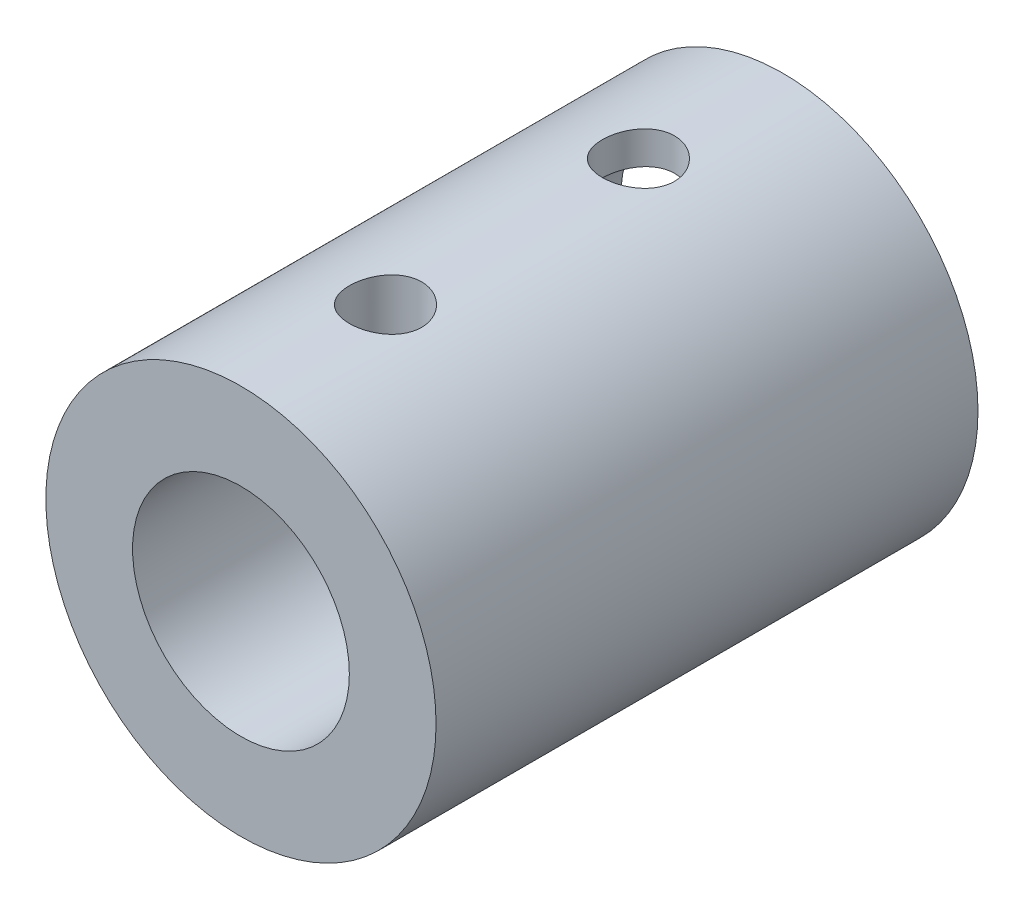
ISO-10303-21;
HEADER;
FILE_DESCRIPTION(('STEP AP214'),'2;1');
FILE_NAME('part.step','',(''),(''),'','','');
FILE_SCHEMA(('AUTOMOTIVE_DESIGN { 1 0 10303 214 1 1 1 1 }'));
ENDSEC;
DATA;
#1=APPLICATION_CONTEXT('core data for automotive mechanical design processes');
#2=APPLICATION_PROTOCOL_DEFINITION('international standard','automotive_design',2000,#1);
#3=PRODUCT_CONTEXT('',#1,'mechanical');
#4=PRODUCT('Part','Part','',(#3));
#5=PRODUCT_RELATED_PRODUCT_CATEGORY('part','',(#4));
#6=PRODUCT_DEFINITION_FORMATION('','',#4);
#7=PRODUCT_DEFINITION_CONTEXT('part definition',#1,'design');
#8=PRODUCT_DEFINITION('design','',#6,#7);
#9=PRODUCT_DEFINITION_SHAPE('','',#8);
#10=(LENGTH_UNIT() NAMED_UNIT(*) SI_UNIT(.MILLI.,.METRE.));
#11=(NAMED_UNIT(*) PLANE_ANGLE_UNIT() SI_UNIT($,.RADIAN.));
#12=(NAMED_UNIT(*) SI_UNIT($,.STERADIAN.) SOLID_ANGLE_UNIT());
#13=UNCERTAINTY_MEASURE_WITH_UNIT(LENGTH_MEASURE(1.E-05),#10,'distance_accuracy_value','');
#14=(GEOMETRIC_REPRESENTATION_CONTEXT(3) GLOBAL_UNCERTAINTY_ASSIGNED_CONTEXT((#13)) GLOBAL_UNIT_ASSIGNED_CONTEXT((#10,
#11,#12)) REPRESENTATION_CONTEXT('',''));
#15=CARTESIAN_POINT('',(0.,0.,0.));
#16=DIRECTION('',(0.,0.,1.));
#17=DIRECTION('',(1.,0.,0.));
#18=AXIS2_PLACEMENT_3D('',#15,#16,#17);
#19=CARTESIAN_POINT('',(0.,0.,0.));
#20=DIRECTION('',(0.,0.,1.));
#21=DIRECTION('',(1.,0.,0.));
#22=AXIS2_PLACEMENT_3D('',#19,#20,#21);
#23=CYLINDRICAL_SURFACE('',#22,5.4);
#24=CARTESIAN_POINT('',(0.,5.4,-4.5));
#25=CARTESIAN_POINT('',(0.0556604896939822,5.39999899659442,-4.49999785988244));
#26=CARTESIAN_POINT('',(0.111348969502443,5.39913052478065,-4.49533716167985));
#27=CARTESIAN_POINT('',(0.221157519706214,5.39574971760259,-4.47682901836152));
#28=CARTESIAN_POINT('',(0.275276211455409,5.3932359803846,-4.46297373883295));
#29=CARTESIAN_POINT('',(0.380341159747422,5.38684592389532,-4.42651451628888));
#30=CARTESIAN_POINT('',(0.431290203036905,5.38297082204496,-4.40391838809039));
#31=CARTESIAN_POINT('',(0.528669059396653,5.37428153225005,-4.35064087689537));
#32=CARTESIAN_POINT('',(0.575099255261279,5.36946742395328,-4.31996017956541));
#33=CARTESIAN_POINT('',(0.662670331022381,5.35936880012669,-4.25100346875391));
#34=CARTESIAN_POINT('',(0.703750717092386,5.35407988568635,-4.21265126783419));
#35=CARTESIAN_POINT('',(0.778932810187149,5.34366050938683,-4.12960413184714));
#36=CARTESIAN_POINT('',(0.813034023333889,5.33853005876308,-4.08490874828609));
#37=CARTESIAN_POINT('',(0.873540311641142,5.32896576362374,-3.99001784987536));
#38=CARTESIAN_POINT('',(0.899884048440948,5.32453759246524,-3.93978260109209));
#39=CARTESIAN_POINT('',(0.94373496793374,5.31694110772514,-3.83550374767132));
#40=CARTESIAN_POINT('',(0.9612428931323,5.31377268828674,-3.78146046347206));
#41=CARTESIAN_POINT('',(0.986731465585703,5.30909866934742,-3.67174623105857));
#42=CARTESIAN_POINT('',(0.994817491817906,5.30757469216746,-3.61610056260907));
#43=CARTESIAN_POINT('',(1.0015597824359,5.30630668029092,-3.50422307986216));
#44=CARTESIAN_POINT('',(1.00021687146053,5.30656248993717,-3.44799131725305));
#45=CARTESIAN_POINT('',(0.988224901570252,5.30880841085454,-3.3373000011608));
#46=CARTESIAN_POINT('',(0.97769550042022,5.31077622168995,-3.28282696511513));
#47=CARTESIAN_POINT('',(0.947817807343393,5.31618940857766,-3.17643418695685));
#48=CARTESIAN_POINT('',(0.928469149021419,5.31963484601746,-3.1245145510243));
#49=CARTESIAN_POINT('',(0.881384660081291,5.32763847511037,-3.02435132487239));
#50=CARTESIAN_POINT('',(0.853600353848329,5.33220306803316,-2.97613105456559));
#51=CARTESIAN_POINT('',(0.790467562244113,5.34192643691731,-2.88499200414442));
#52=CARTESIAN_POINT('',(0.755118327426643,5.34708527172593,-2.84207374995783));
#53=CARTESIAN_POINT('',(0.677213176267708,5.35751311929745,-2.76206552016118));
#54=CARTESIAN_POINT('',(0.634554875003939,5.36278260703325,-2.72507522788993));
#55=CARTESIAN_POINT('',(0.543585529598496,5.37276512878244,-2.65876104678889));
#56=CARTESIAN_POINT('',(0.495274431394655,5.37747815747312,-2.62943723128834));
#57=CARTESIAN_POINT('',(0.394268082578696,5.38582589434646,-2.57927437224751));
#58=CARTESIAN_POINT('',(0.341567659863976,5.38945930668765,-2.55844551395307));
#59=CARTESIAN_POINT('',(0.233333816527491,5.39522837045863,-2.5259636391794));
#60=CARTESIAN_POINT('',(0.177800689988553,5.39736417702724,-2.51430967224649));
#61=CARTESIAN_POINT('',(0.0663356134919621,5.39987612432976,-2.50064672026573));
#62=CARTESIAN_POINT('',(0.0104209521169561,5.40027718700497,-2.49850112351799));
#63=CARTESIAN_POINT('',(-0.100968245481161,5.39934323168058,-2.50354963095807));
#64=CARTESIAN_POINT('',(-0.156442802648481,5.3980082968004,-2.51074328798311));
#65=CARTESIAN_POINT('',(-0.264945081991777,5.39376784929595,-2.53415251483885));
#66=CARTESIAN_POINT('',(-0.317988190561706,5.39087434486991,-2.55029913303865));
#67=CARTESIAN_POINT('',(-0.420614458748235,5.38383985678366,-2.59108145285172));
#68=CARTESIAN_POINT('',(-0.470197387707151,5.37969879005782,-2.61571771974139));
#69=CARTESIAN_POINT('',(-0.565080058501055,5.37056636600975,-2.6730835898021));
#70=CARTESIAN_POINT('',(-0.610328354131309,5.36556639333382,-2.70589688519212));
#71=CARTESIAN_POINT('',(-0.694725332662061,5.35529340783008,-2.77857189616404));
#72=CARTESIAN_POINT('',(-0.73387346032526,5.35002037020603,-2.81843425264735));
#73=CARTESIAN_POINT('',(-0.805476459391045,5.33971312164955,-2.90469365827947));
#74=CARTESIAN_POINT('',(-0.837838206141855,5.33468288206522,-2.95116856224134));
#75=CARTESIAN_POINT('',(-0.894295582963874,5.32551001203301,-3.04897517975559));
#76=CARTESIAN_POINT('',(-0.918391515518115,5.32136734910682,-3.10030671549442));
#77=CARTESIAN_POINT('',(-0.957500388169906,5.31446969122803,-3.20613027902271));
#78=CARTESIAN_POINT('',(-0.972556436956279,5.31170812094277,-3.26060592673707));
#79=CARTESIAN_POINT('',(-0.993291444677279,5.30787012468241,-3.37136947293782));
#80=CARTESIAN_POINT('',(-0.998971432667995,5.30679351377768,-3.42765717185372));
#81=CARTESIAN_POINT('',(-1.00075931276034,5.30645655210111,-3.53951457036673));
#82=CARTESIAN_POINT('',(-0.997014059695887,5.30716833604253,-3.59508189199872));
#83=CARTESIAN_POINT('',(-0.98037882439304,5.31026625942455,-3.70478037964699));
#84=CARTESIAN_POINT('',(-0.967488893630063,5.31265238944026,-3.75891155374557));
#85=CARTESIAN_POINT('',(-0.932991513043014,5.31881854519827,-3.86412474685557));
#86=CARTESIAN_POINT('',(-0.911399587855034,5.32259608758904,-3.91521201097));
#87=CARTESIAN_POINT('',(-0.860127070854903,5.33112125899417,-4.01306235448465));
#88=CARTESIAN_POINT('',(-0.830445927033412,5.33586895420635,-4.05982513849));
#89=CARTESIAN_POINT('',(-0.763325369214999,5.34588620139029,-4.14843547260882));
#90=CARTESIAN_POINT('',(-0.725778938254149,5.35116236451393,-4.19020122576754));
#91=CARTESIAN_POINT('',(-0.64421709909816,5.3615922231753,-4.26688863340875));
#92=CARTESIAN_POINT('',(-0.600200206474231,5.36674589029445,-4.3018087130814));
#93=CARTESIAN_POINT('',(-0.506485845843657,5.37640290849601,-4.36409831671839));
#94=CARTESIAN_POINT('',(-0.456742043621885,5.38090017485251,-4.39139910104173));
#95=CARTESIAN_POINT('',(-0.353306995492875,5.38867830228998,-4.43721254804973));
#96=CARTESIAN_POINT('',(-0.299619539473832,5.39196031337996,-4.45573352383719));
#97=CARTESIAN_POINT('',(-0.204806715075687,5.39626347553588,-4.47967054296795));
#98=CARTESIAN_POINT('',(-0.164238042203387,5.39765680904242,-4.48728115769209));
#99=CARTESIAN_POINT('',(-0.0824513558551124,5.39952543175235,-4.49744661731647));
#100=CARTESIAN_POINT('',(-0.0412333582251356,5.40000074332407,-4.50000158540168));
#101=CARTESIAN_POINT('',(0.,5.4,-4.5));
#102=B_SPLINE_CURVE_WITH_KNOTS('',3,(#24,#25,#26,#27,#28,#29,#30,#31,#32,#33,#34,#35,#36,#37,
#38,#39,#40,#41,#42,#43,#44,#45,#46,#47,#48,#49,#50,#51,#52,#53,#54,#55,#56,#57,#58,#59,#60,#61,
#62,#63,#64,#65,#66,#67,#68,#69,#70,#71,#72,#73,#74,#75,#76,#77,#78,#79,#80,#81,#82,#83,#84,#85,
#86,#87,#88,#89,#90,#91,#92,#93,#94,#95,#96,#97,#98,#99,#100,#101),.UNSPECIFIED.,.T.,.F.,(4,2,2,
2,2,2,2,2,2,2,2,2,2,2,2,2,2,2,2,2,2,2,2,2,2,2,2,2,2,2,2,2,2,2,2,2,2,2,4),(0.,0.166830684743597,
0.333803703486145,0.500627782580659,0.667437717581664,0.835994817748764,1.00456384166177,
1.17443200011244,1.34428588154242,1.51222122651588,1.68014188433212,1.84590742201222,
2.01167984703317,2.1784235199099,2.34518371948756,2.51450617923376,2.68383025847696,
2.85335676051565,3.02286569849921,3.18993114894036,3.35698860059497,3.5227769720103,
3.68857638444373,3.85614796888962,4.02373479680335,4.19348930256164,4.36323759558209,
4.53216984076862,4.70108354380611,4.86738174567473,5.0336790114577,5.19968090169824,
5.36569412276716,5.53413289671374,5.70261037372837,5.87256200203699,6.04235238977767,
6.16594377467511,6.28953214812993),.UNSPECIFIED.);
#103=CARTESIAN_POINT('',(0.,5.4,-4.5));
#104=VERTEX_POINT('',#103);
#105=EDGE_CURVE('E53',#104,#104,#102,.T.);
#106=ORIENTED_EDGE('',*,*,#105,.T.);
#107=EDGE_LOOP('',(#106));
#108=FACE_BOUND('',#107,.T.);
#109=CARTESIAN_POINT('',(0.,0.,-7.5));
#110=DIRECTION('',(0.,0.,1.));
#111=DIRECTION('',(1.,0.,0.));
#112=AXIS2_PLACEMENT_3D('',#109,#110,#111);
#113=CIRCLE('',#112,5.4);
#114=CARTESIAN_POINT('',(5.4,0.,-7.5));
#115=VERTEX_POINT('',#114);
#116=EDGE_CURVE('E10',#115,#115,#113,.T.);
#117=ORIENTED_EDGE('',*,*,#116,.T.);
#118=EDGE_LOOP('',(#117));
#119=FACE_BOUND('',#118,.T.);
#120=CARTESIAN_POINT('',(0.,0.,7.5));
#121=DIRECTION('',(0.,0.,1.));
#122=DIRECTION('',(1.,0.,0.));
#123=AXIS2_PLACEMENT_3D('',#120,#121,#122);
#124=CIRCLE('',#123,5.4);
#125=CARTESIAN_POINT('',(5.4,0.,7.5));
#126=VERTEX_POINT('',#125);
#127=EDGE_CURVE('E44',#126,#126,#124,.T.);
#128=ORIENTED_EDGE('',*,*,#127,.F.);
#129=EDGE_LOOP('',(#128));
#130=FACE_BOUND('',#129,.T.);
#131=CARTESIAN_POINT('',(0.,5.4,2.5));
#132=CARTESIAN_POINT('',(0.0556604896939822,5.39999899659442,2.50000214011756));
#133=CARTESIAN_POINT('',(0.111348969502443,5.39913052478065,2.50466283832015));
#134=CARTESIAN_POINT('',(0.221157519706214,5.39574971760259,2.52317098163848));
#135=CARTESIAN_POINT('',(0.275276211455409,5.3932359803846,2.53702626116705));
#136=CARTESIAN_POINT('',(0.380341159747422,5.38684592389532,2.57348548371112));
#137=CARTESIAN_POINT('',(0.431290203036904,5.38297082204496,2.59608161190961));
#138=CARTESIAN_POINT('',(0.528669059396653,5.37428153225005,2.64935912310463));
#139=CARTESIAN_POINT('',(0.575099255261279,5.36946742395328,2.68003982043459));
#140=CARTESIAN_POINT('',(0.662670331022381,5.35936880012669,2.74899653124609));
#141=CARTESIAN_POINT('',(0.703750717092386,5.35407988568635,2.78734873216581));
#142=CARTESIAN_POINT('',(0.778932810187149,5.34366050938683,2.87039586815286));
#143=CARTESIAN_POINT('',(0.813034023333889,5.33853005876308,2.91509125171391));
#144=CARTESIAN_POINT('',(0.873540311641141,5.32896576362374,3.00998215012464));
#145=CARTESIAN_POINT('',(0.899884048440948,5.32453759246524,3.06021739890791));
#146=CARTESIAN_POINT('',(0.94373496793374,5.31694110772514,3.16449625232868));
#147=CARTESIAN_POINT('',(0.9612428931323,5.31377268828674,3.21853953652794));
#148=CARTESIAN_POINT('',(0.986731465585703,5.30909866934742,3.32825376894143));
#149=CARTESIAN_POINT('',(0.994817491817906,5.30757469216746,3.38389943739093));
#150=CARTESIAN_POINT('',(1.0015597824359,5.30630668029092,3.49577692013784));
#151=CARTESIAN_POINT('',(1.00021687146053,5.30656248993717,3.55200868274695));
#152=CARTESIAN_POINT('',(0.988224901570252,5.30880841085454,3.6626999988392));
#153=CARTESIAN_POINT('',(0.97769550042022,5.31077622168995,3.71717303488487));
#154=CARTESIAN_POINT('',(0.947817807343393,5.31618940857766,3.82356581304315));
#155=CARTESIAN_POINT('',(0.928469149021419,5.31963484601746,3.8754854489757));
#156=CARTESIAN_POINT('',(0.881384660081291,5.32763847511037,3.97564867512761));
#157=CARTESIAN_POINT('',(0.853600353848329,5.33220306803316,4.02386894543441));
#158=CARTESIAN_POINT('',(0.790467562244113,5.34192643691731,4.11500799585558));
#159=CARTESIAN_POINT('',(0.755118327426643,5.34708527172593,4.15792625004217));
#160=CARTESIAN_POINT('',(0.677213176267708,5.35751311929745,4.23793447983882));
#161=CARTESIAN_POINT('',(0.634554875003939,5.36278260703325,4.27492477211007));
#162=CARTESIAN_POINT('',(0.543585529598498,5.37276512878244,4.34123895321111));
#163=CARTESIAN_POINT('',(0.495274431394656,5.37747815747312,4.37056276871166));
#164=CARTESIAN_POINT('',(0.394268082578697,5.38582589434646,4.42072562775249));
#165=CARTESIAN_POINT('',(0.341567659863977,5.38945930668765,4.44155448604693));
#166=CARTESIAN_POINT('',(0.233333816527491,5.39522837045863,4.4740363608206));
#167=CARTESIAN_POINT('',(0.177800689988554,5.39736417702724,4.48569032775351));
#168=CARTESIAN_POINT('',(0.0663356134919625,5.39987612432976,4.49935327973427));
#169=CARTESIAN_POINT('',(0.0104209521169566,5.40027718700497,4.50149887648201));
#170=CARTESIAN_POINT('',(-0.100968245481161,5.39934323168058,4.49645036904193));
#171=CARTESIAN_POINT('',(-0.15644280264848,5.3980082968004,4.48925671201689));
#172=CARTESIAN_POINT('',(-0.264945081991776,5.39376784929595,4.46584748516115));
#173=CARTESIAN_POINT('',(-0.317988190561706,5.39087434486991,4.44970086696135));
#174=CARTESIAN_POINT('',(-0.420614458748234,5.38383985678366,4.40891854714828));
#175=CARTESIAN_POINT('',(-0.47019738770715,5.37969879005782,4.38428228025861));
#176=CARTESIAN_POINT('',(-0.565080058501055,5.37056636600975,4.3269164101979));
#177=CARTESIAN_POINT('',(-0.610328354131309,5.36556639333382,4.29410311480788));
#178=CARTESIAN_POINT('',(-0.694725332662061,5.35529340783008,4.22142810383596));
#179=CARTESIAN_POINT('',(-0.73387346032526,5.35002037020603,4.18156574735265));
#180=CARTESIAN_POINT('',(-0.805476459391044,5.33971312164955,4.09530634172053));
#181=CARTESIAN_POINT('',(-0.837838206141855,5.33468288206522,4.04883143775866));
#182=CARTESIAN_POINT('',(-0.894295582963875,5.32551001203301,3.95102482024441));
#183=CARTESIAN_POINT('',(-0.918391515518115,5.32136734910682,3.89969328450558));
#184=CARTESIAN_POINT('',(-0.957500388169906,5.31446969122803,3.79386972097729));
#185=CARTESIAN_POINT('',(-0.972556436956279,5.31170812094277,3.73939407326293));
#186=CARTESIAN_POINT('',(-0.993291444677279,5.30787012468241,3.62863052706218));
#187=CARTESIAN_POINT('',(-0.998971432667995,5.30679351377768,3.57234282814628));
#188=CARTESIAN_POINT('',(-1.00075931276034,5.30645655210111,3.46048542963327));
#189=CARTESIAN_POINT('',(-0.997014059695887,5.30716833604253,3.40491810800128));
#190=CARTESIAN_POINT('',(-0.98037882439304,5.31026625942455,3.29521962035301));
#191=CARTESIAN_POINT('',(-0.967488893630063,5.31265238944026,3.24108844625443));
#192=CARTESIAN_POINT('',(-0.932991513043014,5.31881854519827,3.13587525314444));
#193=CARTESIAN_POINT('',(-0.911399587855034,5.32259608758904,3.08478798903));
#194=CARTESIAN_POINT('',(-0.860127070854903,5.33112125899417,2.98693764551535));
#195=CARTESIAN_POINT('',(-0.830445927033412,5.33586895420635,2.94017486151));
#196=CARTESIAN_POINT('',(-0.763325369214999,5.34588620139029,2.85156452739118));
#197=CARTESIAN_POINT('',(-0.72577893825415,5.35116236451393,2.80979877423246));
#198=CARTESIAN_POINT('',(-0.64421709909816,5.3615922231753,2.73311136659125));
#199=CARTESIAN_POINT('',(-0.600200206474232,5.36674589029445,2.6981912869186));
#200=CARTESIAN_POINT('',(-0.506485845843658,5.37640290849601,2.63590168328161));
#201=CARTESIAN_POINT('',(-0.456742043621886,5.38090017485251,2.60860089895827));
#202=CARTESIAN_POINT('',(-0.353306995492876,5.38867830228998,2.56278745195027));
#203=CARTESIAN_POINT('',(-0.299619539473833,5.39196031337996,2.54426647616281));
#204=CARTESIAN_POINT('',(-0.204806715075687,5.39626347553588,2.52032945703205));
#205=CARTESIAN_POINT('',(-0.164238042203387,5.39765680904242,2.51271884230791));
#206=CARTESIAN_POINT('',(-0.082451355855112,5.39952543175235,2.50255338268353));
#207=CARTESIAN_POINT('',(-0.0412333582251354,5.40000074332407,2.49999841459832));
#208=CARTESIAN_POINT('',(0.,5.4,2.5));
#209=B_SPLINE_CURVE_WITH_KNOTS('',3,(#131,#132,#133,#134,#135,#136,#137,#138,#139,#140,#141,
#142,#143,#144,#145,#146,#147,#148,#149,#150,#151,#152,#153,#154,#155,#156,#157,#158,#159,#160,
#161,#162,#163,#164,#165,#166,#167,#168,#169,#170,#171,#172,#173,#174,#175,#176,#177,#178,#179,
#180,#181,#182,#183,#184,#185,#186,#187,#188,#189,#190,#191,#192,#193,#194,#195,#196,#197,#198,
#199,#200,#201,#202,#203,#204,#205,#206,#207,#208),.UNSPECIFIED.,.T.,.F.,(4,2,2,2,2,2,2,2,2,2,2,
2,2,2,2,2,2,2,2,2,2,2,2,2,2,2,2,2,2,2,2,2,2,2,2,2,2,2,4),(0.,0.166830684743597,
0.333803703486145,0.500627782580658,0.667437717581664,0.835994817748764,1.00456384166177,
1.17443200011244,1.34428588154242,1.51222122651588,1.68014188433212,1.84590742201222,
2.01167984703316,2.1784235199099,2.34518371948756,2.51450617923376,2.68383025847696,
2.85335676051565,3.02286569849921,3.18993114894036,3.35698860059497,3.5227769720103,
3.68857638444373,3.85614796888962,4.02373479680335,4.19348930256164,4.3632375955821,
4.53216984076862,4.70108354380611,4.86738174567473,5.0336790114577,5.19968090169824,
5.36569412276716,5.53413289671374,5.70261037372837,5.87256200203699,6.04235238977767,
6.16594377467512,6.28953214812993),.UNSPECIFIED.);
#210=CARTESIAN_POINT('',(0.,5.4,2.5));
#211=VERTEX_POINT('',#210);
#212=EDGE_CURVE('E49',#211,#211,#209,.T.);
#213=ORIENTED_EDGE('',*,*,#212,.T.);
#214=EDGE_LOOP('',(#213));
#215=FACE_BOUND('',#214,.T.);
#216=ADVANCED_FACE('F31',(#108,#119,#130,#215),#23,.T.);
#217=CARTESIAN_POINT('',(0.,0.,7.5));
#218=DIRECTION('',(0.,0.,1.));
#219=DIRECTION('',(1.,0.,0.));
#220=AXIS2_PLACEMENT_3D('',#217,#218,#219);
#221=PLANE('',#220);
#222=CARTESIAN_POINT('',(0.,0.,7.5));
#223=DIRECTION('',(0.,0.,1.));
#224=DIRECTION('',(1.,0.,0.));
#225=AXIS2_PLACEMENT_3D('',#222,#223,#224);
#226=CIRCLE('',#225,3.);
#227=CARTESIAN_POINT('',(3.,0.,7.5));
#228=VERTEX_POINT('',#227);
#229=EDGE_CURVE('E84',#228,#228,#226,.T.);
#230=ORIENTED_EDGE('',*,*,#229,.F.);
#231=EDGE_LOOP('',(#230));
#232=FACE_BOUND('',#231,.T.);
#233=ORIENTED_EDGE('',*,*,#127,.T.);
#234=EDGE_LOOP('',(#233));
#235=FACE_BOUND('',#234,.T.);
#236=ADVANCED_FACE('F33',(#232,#235),#221,.T.);
#237=CARTESIAN_POINT('',(0.,0.,-7.5));
#238=DIRECTION('',(0.,0.,-1.));
#239=DIRECTION('',(-1.,0.,0.));
#240=AXIS2_PLACEMENT_3D('',#237,#238,#239);
#241=PLANE('',#240);
#242=CARTESIAN_POINT('',(0.,0.,-7.5));
#243=DIRECTION('',(0.,0.,-1.));
#244=DIRECTION('',(-1.,0.,0.));
#245=AXIS2_PLACEMENT_3D('',#242,#243,#244);
#246=CIRCLE('',#245,4.5);
#247=CARTESIAN_POINT('',(-4.5,0.,-7.5));
#248=VERTEX_POINT('',#247);
#249=EDGE_CURVE('E94',#248,#248,#246,.T.);
#250=ORIENTED_EDGE('',*,*,#249,.F.);
#251=EDGE_LOOP('',(#250));
#252=FACE_BOUND('',#251,.T.);
#253=ORIENTED_EDGE('',*,*,#116,.F.);
#254=EDGE_LOOP('',(#253));
#255=FACE_BOUND('',#254,.T.);
#256=ADVANCED_FACE('F70',(#252,#255),#241,.T.);
#257=CARTESIAN_POINT('',(0.,10.,-3.5));
#258=DIRECTION('',(0.,-1.,0.));
#259=DIRECTION('',(0.,0.,-1.));
#260=AXIS2_PLACEMENT_3D('',#257,#258,#259);
#261=CYLINDRICAL_SURFACE('',#260,1.);
#262=CARTESIAN_POINT('',(0.,4.5,-4.5));
#263=CARTESIAN_POINT('',(-0.0554402383878237,4.49999898109126,-4.49999813816009));
#264=CARTESIAN_POINT('',(-0.11090278263481,4.49896506997846,-4.49537400916826));
#265=CARTESIAN_POINT('',(-0.220250972051566,4.49494048878835,-4.47701976382472));
#266=CARTESIAN_POINT('',(-0.274135487569493,4.49194845108674,-4.46328328299536));
#267=CARTESIAN_POINT('',(-0.378731638880764,4.48434056584504,-4.42715701475417));
#268=CARTESIAN_POINT('',(-0.429446576050142,4.47972644219541,-4.40477641150107));
#269=CARTESIAN_POINT('',(-0.52640009015688,4.46937167720689,-4.3520266937638));
#270=CARTESIAN_POINT('',(-0.572638753966673,4.46363105773679,-4.32165773435469));
#271=CARTESIAN_POINT('',(-0.660093157007017,4.45154547087105,-4.25326216744666));
#272=CARTESIAN_POINT('',(-0.701224306021767,4.44519280820714,-4.21512874893243));
#273=CARTESIAN_POINT('',(-0.776562455229185,4.43265300539893,-4.13251596995343));
#274=CARTESIAN_POINT('',(-0.810768822054276,4.42646588044024,-4.08803602964477));
#275=CARTESIAN_POINT('',(-0.871662217051752,4.41488164130856,-3.99336407797085));
#276=CARTESIAN_POINT('',(-0.898258710522017,4.40949437871491,-3.94311252097924));
#277=CARTESIAN_POINT('',(-0.94259649477254,4.40023048176198,-3.83871361915379));
#278=CARTESIAN_POINT('',(-0.96033888110048,4.39635366052386,-3.78456675724787));
#279=CARTESIAN_POINT('',(-0.986184290032021,4.39062804729594,-3.67483326133867));
#280=CARTESIAN_POINT('',(-0.994437335190343,4.38874772903892,-3.61928364244729));
#281=CARTESIAN_POINT('',(-1.00153635498836,4.38713336865335,-3.5075588911069));
#282=CARTESIAN_POINT('',(-1.00038352455831,4.38739905389469,-3.45138383901893));
#283=CARTESIAN_POINT('',(-0.988824137586508,4.39001816074073,-3.3411216864031));
#284=CARTESIAN_POINT('',(-0.978592322301084,4.3923321569242,-3.28701518793033));
#285=CARTESIAN_POINT('',(-0.949442453405729,4.39872477095838,-3.1813064283375));
#286=CARTESIAN_POINT('',(-0.930523898408257,4.40280349066588,-3.1297043119573));
#287=CARTESIAN_POINT('',(-0.884378364364372,4.41230454985148,-3.02998028080906));
#288=CARTESIAN_POINT('',(-0.857084596896763,4.41773762181245,-2.98189033633196));
#289=CARTESIAN_POINT('',(-0.795010340699247,4.42932868955372,-2.89090856474205));
#290=CARTESIAN_POINT('',(-0.76022880037137,4.43548678710298,-2.84801746908993));
#291=CARTESIAN_POINT('',(-0.683243418514913,4.44800287306333,-2.76764534532576));
#292=CARTESIAN_POINT('',(-0.640891102633116,4.45436225343936,-2.73030660744747));
#293=CARTESIAN_POINT('',(-0.550453309045809,4.46643919561158,-2.66323813554644));
#294=CARTESIAN_POINT('',(-0.502367720918685,4.47215674504213,-2.63350854810905));
#295=CARTESIAN_POINT('',(-0.401651595367367,4.48232532116804,-2.5824653621116));
#296=CARTESIAN_POINT('',(-0.349011061159926,4.4867734650383,-2.56117087784587));
#297=CARTESIAN_POINT('',(-0.240777965490727,4.49388068183127,-2.52776949347106));
#298=CARTESIAN_POINT('',(-0.185185848796682,4.49654002348392,-2.51566121329294));
#299=CARTESIAN_POINT('',(-0.0738477416404216,4.49973158880836,-2.50118399337241));
#300=CARTESIAN_POINT('',(-0.0181281986594518,4.50030624311145,-2.49862074991916));
#301=CARTESIAN_POINT('',(0.0929429619640405,4.49938279325299,-2.50277905213018));
#302=CARTESIAN_POINT('',(0.148294605135324,4.4978848344523,-2.50949994665972));
#303=CARTESIAN_POINT('',(0.256411628664712,4.49301129379307,-2.53187470758405));
#304=CARTESIAN_POINT('',(0.309199245857743,4.4896572350388,-2.54742622811172));
#305=CARTESIAN_POINT('',(0.411416402927916,4.48144710543397,-2.58690684372254));
#306=CARTESIAN_POINT('',(0.46084565000509,4.4765909038233,-2.610836668153));
#307=CARTESIAN_POINT('',(0.55574321994719,4.4658107661382,-2.66679643839949));
#308=CARTESIAN_POINT('',(0.601142865416124,4.45987222295123,-2.69893997150308));
#309=CARTESIAN_POINT('',(0.68597348249406,4.4476151617454,-2.77026562455072));
#310=CARTESIAN_POINT('',(0.725403650867064,4.44129659275087,-2.80944869016605));
#311=CARTESIAN_POINT('',(0.797947740954928,4.42884439472905,-2.89463401679035));
#312=CARTESIAN_POINT('',(0.830926909700367,4.42271658832142,-2.9407520450033));
#313=CARTESIAN_POINT('',(0.888673059613761,4.41147697689154,-3.03798601720541));
#314=CARTESIAN_POINT('',(0.913440399634869,4.40636512747635,-3.08910174267105));
#315=CARTESIAN_POINT('',(0.953890009481296,4.39778600274463,-3.19460414455257));
#316=CARTESIAN_POINT('',(0.969623931773796,4.39430939829893,-3.24897022113442));
#317=CARTESIAN_POINT('',(0.99171013829203,4.38937824848696,-3.35966209243124));
#318=CARTESIAN_POINT('',(0.998063978591782,4.38792336773666,-3.41598756051298));
#319=CARTESIAN_POINT('',(1.00114178320522,4.38722200724489,-3.52763943913916));
#320=CARTESIAN_POINT('',(0.998079565719667,4.38792649185062,-3.58295975403003));
#321=CARTESIAN_POINT('',(0.982891385608439,4.39135332478774,-3.69227485498341));
#322=CARTESIAN_POINT('',(0.970765537001198,4.39407564773517,-3.74626965771174));
#323=CARTESIAN_POINT('',(0.937899099903722,4.40120714065762,-3.85122456011369));
#324=CARTESIAN_POINT('',(0.917190583142268,4.40561002591385,-3.9021951584408));
#325=CARTESIAN_POINT('',(0.86777385174171,4.41560882234529,-3.99996999627336));
#326=CARTESIAN_POINT('',(0.839064772925968,4.42120486238316,-4.04677378498201));
#327=CARTESIAN_POINT('',(0.77375679495279,4.43310521417665,-4.13593830447399));
#328=CARTESIAN_POINT('',(0.737005927555191,4.4394218568387,-4.17818610246133));
#329=CARTESIAN_POINT('',(0.65696435297252,4.45196987086694,-4.25598503696566));
#330=CARTESIAN_POINT('',(0.613672133116717,4.45820122214526,-4.29153462025421));
#331=CARTESIAN_POINT('',(0.521072985322783,4.46997629863291,-4.35538799145996));
#332=CARTESIAN_POINT('',(0.471692818317475,4.47550961749614,-4.38358759986747));
#333=CARTESIAN_POINT('',(0.368780139889409,4.48516029184624,-4.4312416520906));
#334=CARTESIAN_POINT('',(0.315251101656498,4.48927881635408,-4.45070332002308));
#335=CARTESIAN_POINT('',(0.218069123864705,4.49491406454777,-4.47692067513839));
#336=CARTESIAN_POINT('',(0.174935995950841,4.49680934511605,-4.48555868683314));
#337=CARTESIAN_POINT('',(0.0878732249472645,4.49935268729894,-4.49709895215308));
#338=CARTESIAN_POINT('',(0.0439436194464395,4.50000080761806,-4.50000147575095));
#339=CARTESIAN_POINT('',(0.,4.5,-4.5));
#340=B_SPLINE_CURVE_WITH_KNOTS('',3,(#262,#263,#264,#265,#266,#267,#268,#269,#270,#271,#272,
#273,#274,#275,#276,#277,#278,#279,#280,#281,#282,#283,#284,#285,#286,#287,#288,#289,#290,#291,
#292,#293,#294,#295,#296,#297,#298,#299,#300,#301,#302,#303,#304,#305,#306,#307,#308,#309,#310,
#311,#312,#313,#314,#315,#316,#317,#318,#319,#320,#321,#322,#323,#324,#325,#326,#327,#328,#329,
#330,#331,#332,#333,#334,#335,#336,#337,#338,#339),.UNSPECIFIED.,.T.,.F.,(4,2,2,2,2,2,2,2,2,2,2,
2,2,2,2,2,2,2,2,2,2,2,2,2,2,2,2,2,2,2,2,2,2,2,2,2,2,2,4),(0.,0.166159844864898,
0.332435865624642,0.498535706203729,0.664632322584946,0.833190360010395,1.00176380745257,
1.17226648148988,1.3427480534387,1.51049562819053,1.67822189248295,1.84278834072892,
2.0073642887347,2.17328834854791,2.3392357262915,2.50889089904488,2.67854933984914,
2.84859006405619,3.01860523750994,3.18513996062134,3.35166300456134,3.51629434712583,
3.68094002472729,3.84799901631021,4.01508046693878,4.18534736552864,4.35560682255206,
4.52488279527622,4.69413068343205,4.85956392571208,5.02499508691429,5.1898135600789,
5.35464984293193,5.52292163156413,5.69123239233205,5.86181293524784,6.03225218935468,
6.16396173679278,6.29566508443975),.UNSPECIFIED.);
#341=CARTESIAN_POINT('',(0.,4.5,-4.5));
#342=VERTEX_POINT('',#341);
#343=EDGE_CURVE('E35',#342,#342,#340,.T.);
#344=ORIENTED_EDGE('',*,*,#343,.F.);
#345=EDGE_LOOP('',(#344));
#346=FACE_BOUND('',#345,.T.);
#347=ORIENTED_EDGE('',*,*,#105,.F.);
#348=EDGE_LOOP('',(#347));
#349=FACE_BOUND('',#348,.T.);
#350=ADVANCED_FACE('F66',(#346,#349),#261,.F.);
#351=CARTESIAN_POINT('',(0.,10.,3.5));
#352=DIRECTION('',(0.,-1.,0.));
#353=DIRECTION('',(0.,0.,-1.));
#354=AXIS2_PLACEMENT_3D('',#351,#352,#353);
#355=CYLINDRICAL_SURFACE('',#354,1.);
#356=CARTESIAN_POINT('',(0.,3.,2.5));
#357=CARTESIAN_POINT('',(-0.0545633628867228,3.00000015300943,2.49999974626836));
#358=CARTESIAN_POINT('',(-0.109125194538549,2.99849769507545,2.50448026612722));
#359=CARTESIAN_POINT('',(-0.216641760872972,2.99265210203281,2.52222910881722));
#360=CARTESIAN_POINT('',(-0.269596328118817,2.98830867202153,2.53549834394892));
#361=CARTESIAN_POINT('',(-0.372332789501776,2.97725307906443,2.57031924338405));
#362=CARTESIAN_POINT('',(-0.422119825886034,2.97054487730853,2.59185706245927));
#363=CARTESIAN_POINT('',(-0.517374936805324,2.95544445717342,2.64254117283835));
#364=CARTESIAN_POINT('',(-0.562842156958705,2.94705190667778,2.6716889650026));
#365=CARTESIAN_POINT('',(-0.649741675022266,2.92914094443005,2.73782580485875));
#366=CARTESIAN_POINT('',(-0.691003700298309,2.91959556463785,2.77503123426049));
#367=CARTESIAN_POINT('',(-0.766832692702083,2.90060314783122,2.85576715470657));
#368=CARTESIAN_POINT('',(-0.801398185489462,2.89115613290549,2.89929903492851));
#369=CARTESIAN_POINT('',(-0.863824942227858,2.87313332477274,2.99298511519646));
#370=CARTESIAN_POINT('',(-0.891464858221031,2.86459039275688,3.04329373973212));
#371=CARTESIAN_POINT('',(-0.937818873877721,2.84975305418601,3.14817609445855));
#372=CARTESIAN_POINT('',(-0.956535697386764,2.84345796160746,3.20274851716274));
#373=CARTESIAN_POINT('',(-0.983873461509163,2.83411303269377,3.31267322149671));
#374=CARTESIAN_POINT('',(-0.992813448271769,2.83096095769611,3.36793720848906));
#375=CARTESIAN_POINT('',(-1.00134112333448,2.82795656629508,3.47926375415588));
#376=CARTESIAN_POINT('',(-1.00093170160472,2.8281032302273,3.53532606070919));
#377=CARTESIAN_POINT('',(-0.991019903703418,2.8315901500818,3.64393663044402));
#378=CARTESIAN_POINT('',(-0.981933913166994,2.83478415867533,3.69652840291902));
#379=CARTESIAN_POINT('',(-0.955606162849417,2.84376657724551,3.79939341960683));
#380=CARTESIAN_POINT('',(-0.938363426591871,2.84955529784108,3.84966638543507));
#381=CARTESIAN_POINT('',(-0.895939058060211,2.86317911131249,3.94741274959148));
#382=CARTESIAN_POINT('',(-0.870634048707262,2.87104565793117,3.99482802546953));
#383=CARTESIAN_POINT('',(-0.812889106303139,2.88792558575726,4.08487090827973));
#384=CARTESIAN_POINT('',(-0.780447112364005,2.89693929790464,4.12749712693338));
#385=CARTESIAN_POINT('',(-0.707349332682237,2.91567329167741,4.20909159816077));
#386=CARTESIAN_POINT('',(-0.666353150076311,2.92540589354843,4.24775269450907));
#387=CARTESIAN_POINT('',(-0.578339569970064,2.94406938387037,4.3177312666634));
#388=CARTESIAN_POINT('',(-0.531321595660815,2.95300019538067,4.3490480381645));
#389=CARTESIAN_POINT('',(-0.431947613046268,2.96917107937794,4.40369630023507));
#390=CARTESIAN_POINT('',(-0.379543276416337,2.97639350008039,4.42694549134073));
#391=CARTESIAN_POINT('',(-0.271269083364508,2.98820567144435,4.46420317395571));
#392=CARTESIAN_POINT('',(-0.215400438154954,2.99279633654879,4.47821487542344));
#393=CARTESIAN_POINT('',(-0.104383829529304,2.99867627071441,4.49605566602236));
#394=CARTESIAN_POINT('',(-0.049309599864845,3.00010001833731,4.50029980917275));
#395=CARTESIAN_POINT('',(0.0607750699602366,2.99988902694825,4.49966732640153));
#396=CARTESIAN_POINT('',(0.115785519319647,2.99825480419352,4.49479224002013));
#397=CARTESIAN_POINT('',(0.222519866304259,2.99220024717114,4.47638809226403));
#398=CARTESIAN_POINT('',(0.274292806834856,2.98786198711228,4.46311379395048));
#399=CARTESIAN_POINT('',(0.374855958579561,2.97691846830034,4.4286065555333));
#400=CARTESIAN_POINT('',(0.423645788508559,2.97031292046541,4.40737260053232));
#401=CARTESIAN_POINT('',(0.518288296393321,2.95528931287427,4.3569295681591));
#402=CARTESIAN_POINT('',(0.56402995921733,2.94682814756305,4.3275254067164));
#403=CARTESIAN_POINT('',(0.650064830135404,2.92905253915743,4.26180584998695));
#404=CARTESIAN_POINT('',(0.690356367794894,2.91973783591888,4.22548834396984));
#405=CARTESIAN_POINT('',(0.766252507807013,2.90076847982472,4.14502124899174));
#406=CARTESIAN_POINT('',(0.801560969248492,2.89111761095155,4.10059077306675));
#407=CARTESIAN_POINT('',(0.864257522320854,2.87299973286981,4.0062284321955));
#408=CARTESIAN_POINT('',(0.891645547920844,2.8645327335312,3.9562965213898));
#409=CARTESIAN_POINT('',(0.937596930423361,2.84982391820308,3.85232698469341));
#410=CARTESIAN_POINT('',(0.956178132197766,2.84357760900632,3.79829792075722));
#411=CARTESIAN_POINT('',(0.983894666792163,2.83410832399133,3.68762134987585));
#412=CARTESIAN_POINT('',(0.993034254961244,2.83088398622698,3.63097503456694));
#413=CARTESIAN_POINT('',(1.00127628247038,2.82797858875071,3.51980290398679));
#414=CARTESIAN_POINT('',(1.00087025731093,2.82812400344299,3.46531765974826));
#415=CARTESIAN_POINT('',(0.991242293454878,2.8315126992356,3.35723492510026));
#416=CARTESIAN_POINT('',(0.982020879458888,2.83475579595884,3.30363738204709));
#417=CARTESIAN_POINT('',(0.955371813126981,2.84384524278943,3.19986433698733));
#418=CARTESIAN_POINT('',(0.93810334601488,2.84964098015514,3.14964317499277));
#419=CARTESIAN_POINT('',(0.895979365760382,2.86316398825434,3.05277259306447));
#420=CARTESIAN_POINT('',(0.87112216855398,2.87089168765297,3.00612396881274));
#421=CARTESIAN_POINT('',(0.81326069258325,2.8878282922406,2.91551633007631));
#422=CARTESIAN_POINT('',(0.779948242764533,2.89708711641604,2.87176349810141));
#423=CARTESIAN_POINT('',(0.706642883135698,2.91583356283786,2.79031018661601));
#424=CARTESIAN_POINT('',(0.666648084451496,2.92532124912518,2.75261142431198));
#425=CARTESIAN_POINT('',(0.579241556920675,2.94390030525393,2.68285558771076));
#426=CARTESIAN_POINT('',(0.531601513499726,2.95296181801216,2.65107565224899));
#427=CARTESIAN_POINT('',(0.431357357406629,2.96925991172652,2.59600957114937));
#428=CARTESIAN_POINT('',(0.37875451813235,2.9764969590794,2.57272125407796));
#429=CARTESIAN_POINT('',(0.272493647200976,2.98805515068532,2.53627836751132));
#430=CARTESIAN_POINT('',(0.218987757676409,2.9924921242252,2.52271753373662));
#431=CARTESIAN_POINT('',(0.110320416010248,2.99846407064224,2.50457971932288));
#432=CARTESIAN_POINT('',(0.055159425568747,2.99999984531906,2.50000025650346));
#433=CARTESIAN_POINT('',(0.,3.,2.5));
#434=B_SPLINE_CURVE_WITH_KNOTS('',3,(#356,#357,#358,#359,#360,#361,#362,#363,#364,#365,#366,
#367,#368,#369,#370,#371,#372,#373,#374,#375,#376,#377,#378,#379,#380,#381,#382,#383,#384,#385,
#386,#387,#388,#389,#390,#391,#392,#393,#394,#395,#396,#397,#398,#399,#400,#401,#402,#403,#404,
#405,#406,#407,#408,#409,#410,#411,#412,#413,#414,#415,#416,#417,#418,#419,#420,#421,#422,#423,
#424,#425,#426,#427,#428,#429,#430,#431,#432,#433),.UNSPECIFIED.,.T.,.F.,(4,2,2,2,2,2,2,2,2,2,2,
2,2,2,2,2,2,2,2,2,2,2,2,2,2,2,2,2,2,2,2,2,2,2,2,2,2,2,4),(0.,0.163487106026011,
0.326991185267521,0.490222672870274,0.6534863777991,0.821846842827559,0.990244332875302,
1.1634838482347,1.33667044692833,1.5040192574184,1.67131633987485,1.8309682655128,
1.99063930855482,2.15288171155131,2.31517102558207,2.48593305811367,2.65671145966618,
2.82918405650357,3.00159668877208,3.1665358317517,3.33144713164176,3.49158157978213,
3.65173645284104,3.81610399843736,3.98052180821891,4.15241022880752,4.32430008234997,
4.49584013824416,4.66730284700846,4.82995666056619,4.99260079341185,5.15215587070227,
5.31174638165787,5.47830066681615,5.64490211113589,5.8179966082491,5.99104681142266,
6.15636558363624,6.3216386602795),.UNSPECIFIED.);
#435=CARTESIAN_POINT('',(0.,3.,2.5));
#436=VERTEX_POINT('',#435);
#437=EDGE_CURVE('E60',#436,#436,#434,.T.);
#438=ORIENTED_EDGE('',*,*,#437,.F.);
#439=EDGE_LOOP('',(#438));
#440=FACE_BOUND('',#439,.T.);
#441=ORIENTED_EDGE('',*,*,#212,.F.);
#442=EDGE_LOOP('',(#441));
#443=FACE_BOUND('',#442,.T.);
#444=ADVANCED_FACE('F69',(#440,#443),#355,.F.);
#445=CARTESIAN_POINT('',(0.,0.,0.));
#446=DIRECTION('',(0.,0.,1.));
#447=DIRECTION('',(1.,0.,0.));
#448=AXIS2_PLACEMENT_3D('',#445,#446,#447);
#449=CYLINDRICAL_SURFACE('',#448,3.);
#450=ORIENTED_EDGE('',*,*,#437,.T.);
#451=EDGE_LOOP('',(#450));
#452=FACE_BOUND('',#451,.T.);
#453=CARTESIAN_POINT('',(0.,0.,0.));
#454=DIRECTION('',(0.,0.,1.));
#455=DIRECTION('',(1.,0.,0.));
#456=AXIS2_PLACEMENT_3D('',#453,#454,#455);
#457=CIRCLE('',#456,3.);
#458=CARTESIAN_POINT('',(3.,0.,0.));
#459=VERTEX_POINT('',#458);
#460=EDGE_CURVE('E88',#459,#459,#457,.T.);
#461=ORIENTED_EDGE('',*,*,#460,.F.);
#462=EDGE_LOOP('',(#461));
#463=FACE_BOUND('',#462,.T.);
#464=ORIENTED_EDGE('',*,*,#229,.T.);
#465=EDGE_LOOP('',(#464));
#466=FACE_BOUND('',#465,.T.);
#467=ADVANCED_FACE('F76',(#452,#463,#466),#449,.F.);
#468=CARTESIAN_POINT('',(0.,0.,0.));
#469=DIRECTION('',(0.,0.,-1.));
#470=DIRECTION('',(-1.,0.,0.));
#471=AXIS2_PLACEMENT_3D('',#468,#469,#470);
#472=PLANE('',#471);
#473=CARTESIAN_POINT('',(0.,0.,0.));
#474=DIRECTION('',(0.,0.,-1.));
#475=DIRECTION('',(-1.,0.,0.));
#476=AXIS2_PLACEMENT_3D('',#473,#474,#475);
#477=CIRCLE('',#476,4.5);
#478=CARTESIAN_POINT('',(-4.5,0.,0.));
#479=VERTEX_POINT('',#478);
#480=EDGE_CURVE('E97',#479,#479,#477,.T.);
#481=ORIENTED_EDGE('',*,*,#480,.T.);
#482=EDGE_LOOP('',(#481));
#483=FACE_BOUND('',#482,.T.);
#484=ORIENTED_EDGE('',*,*,#460,.T.);
#485=EDGE_LOOP('',(#484));
#486=FACE_BOUND('',#485,.T.);
#487=ADVANCED_FACE('F129',(#483,#486),#472,.T.);
#488=CARTESIAN_POINT('',(0.,0.,0.));
#489=DIRECTION('',(0.,0.,-1.));
#490=DIRECTION('',(-1.,0.,0.));
#491=AXIS2_PLACEMENT_3D('',#488,#489,#490);
#492=CYLINDRICAL_SURFACE('',#491,4.5);
#493=ORIENTED_EDGE('',*,*,#343,.T.);
#494=EDGE_LOOP('',(#493));
#495=FACE_BOUND('',#494,.T.);
#496=ORIENTED_EDGE('',*,*,#480,.F.);
#497=EDGE_LOOP('',(#496));
#498=FACE_BOUND('',#497,.T.);
#499=ORIENTED_EDGE('',*,*,#249,.T.);
#500=EDGE_LOOP('',(#499));
#501=FACE_BOUND('',#500,.T.);
#502=ADVANCED_FACE('F104',(#495,#498,#501),#492,.F.);
#503=CLOSED_SHELL('',(#216,#236,#256,#350,#444,#467,#487,#502));
#504=MANIFOLD_SOLID_BREP('B2',#503);
#505=ADVANCED_BREP_SHAPE_REPRESENTATION('',(#18,#504),#14);
#506=SHAPE_DEFINITION_REPRESENTATION(#9,#505);
ENDSEC;
END-ISO-10303-21;
